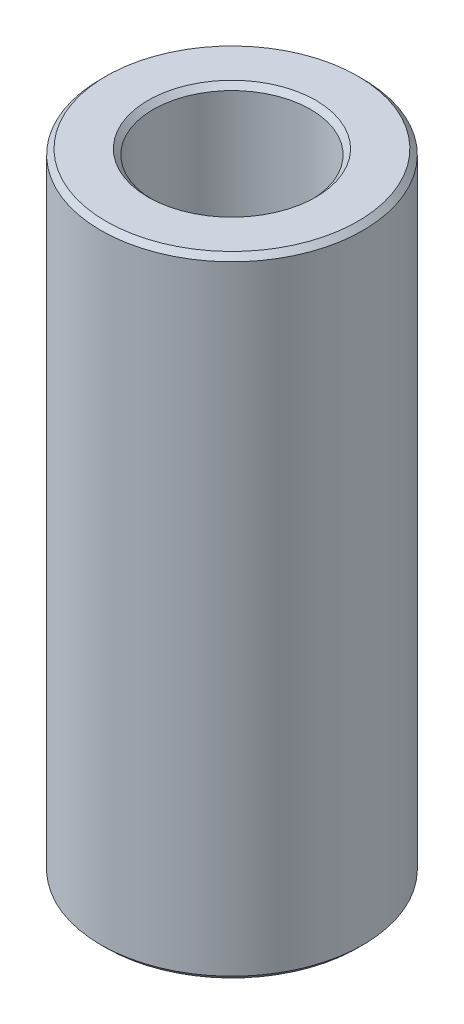
ISO-10303-21;
HEADER;
FILE_DESCRIPTION(('STEP AP214'),'2;1');
FILE_NAME('part.step','',(''),(''),'','','');
FILE_SCHEMA(('AUTOMOTIVE_DESIGN { 1 0 10303 214 1 1 1 1 }'));
ENDSEC;
DATA;
#1=APPLICATION_CONTEXT('core data for automotive mechanical design processes');
#2=APPLICATION_PROTOCOL_DEFINITION('international standard','automotive_design',2000,#1);
#3=PRODUCT_CONTEXT('',#1,'mechanical');
#4=PRODUCT('Part','Part','',(#3));
#5=PRODUCT_RELATED_PRODUCT_CATEGORY('part','',(#4));
#6=PRODUCT_DEFINITION_FORMATION('','',#4);
#7=PRODUCT_DEFINITION_CONTEXT('part definition',#1,'design');
#8=PRODUCT_DEFINITION('design','',#6,#7);
#9=PRODUCT_DEFINITION_SHAPE('','',#8);
#10=(LENGTH_UNIT() NAMED_UNIT(*) SI_UNIT(.MILLI.,.METRE.));
#11=(NAMED_UNIT(*) PLANE_ANGLE_UNIT() SI_UNIT($,.RADIAN.));
#12=(NAMED_UNIT(*) SI_UNIT($,.STERADIAN.) SOLID_ANGLE_UNIT());
#13=UNCERTAINTY_MEASURE_WITH_UNIT(LENGTH_MEASURE(1.E-05),#10,'distance_accuracy_value','');
#14=(GEOMETRIC_REPRESENTATION_CONTEXT(3) GLOBAL_UNCERTAINTY_ASSIGNED_CONTEXT((#13)) GLOBAL_UNIT_ASSIGNED_CONTEXT((#10,
#11,#12)) REPRESENTATION_CONTEXT('',''));
#15=CARTESIAN_POINT('',(0.,0.,0.));
#16=DIRECTION('',(0.,0.,1.));
#17=DIRECTION('',(1.,0.,0.));
#18=AXIS2_PLACEMENT_3D('',#15,#16,#17);
#19=CARTESIAN_POINT('',(0.,12.,0.));
#20=DIRECTION('',(0.,1.,0.));
#21=DIRECTION('',(0.,0.,1.));
#22=AXIS2_PLACEMENT_3D('',#19,#20,#21);
#23=PLANE('',#22);
#24=CARTESIAN_POINT('',(0.,12.,0.));
#25=DIRECTION('',(0.,1.,0.));
#26=DIRECTION('',(0.,0.,1.));
#27=AXIS2_PLACEMENT_3D('',#24,#25,#26);
#28=CIRCLE('',#27,1.6);
#29=CARTESIAN_POINT('',(0.,12.,1.6));
#30=VERTEX_POINT('',#29);
#31=EDGE_CURVE('E54',#30,#30,#28,.F.);
#32=ORIENTED_EDGE('',*,*,#31,.T.);
#33=EDGE_LOOP('',(#32));
#34=FACE_BOUND('',#33,.T.);
#35=CARTESIAN_POINT('',(0.,12.,0.));
#36=DIRECTION('',(0.,1.,0.));
#37=DIRECTION('',(0.,0.,1.));
#38=AXIS2_PLACEMENT_3D('',#35,#36,#37);
#39=CIRCLE('',#38,2.4);
#40=CARTESIAN_POINT('',(0.,12.,2.4));
#41=VERTEX_POINT('',#40);
#42=EDGE_CURVE('E57',#41,#41,#39,.T.);
#43=ORIENTED_EDGE('',*,*,#42,.T.);
#44=EDGE_LOOP('',(#43));
#45=FACE_BOUND('',#44,.T.);
#46=ADVANCED_FACE('F33',(#34,#45),#23,.T.);
#47=CARTESIAN_POINT('',(0.,0.,0.));
#48=DIRECTION('',(0.,1.,0.));
#49=DIRECTION('',(0.,0.,1.));
#50=AXIS2_PLACEMENT_3D('',#47,#48,#49);
#51=PLANE('',#50);
#52=CARTESIAN_POINT('',(0.,0.,0.));
#53=DIRECTION('',(0.,1.,0.));
#54=DIRECTION('',(0.,0.,1.));
#55=AXIS2_PLACEMENT_3D('',#52,#53,#54);
#56=CIRCLE('',#55,1.6);
#57=CARTESIAN_POINT('',(0.,0.,1.6));
#58=VERTEX_POINT('',#57);
#59=EDGE_CURVE('E10',#58,#58,#56,.T.);
#60=ORIENTED_EDGE('',*,*,#59,.T.);
#61=EDGE_LOOP('',(#60));
#62=FACE_BOUND('',#61,.T.);
#63=CARTESIAN_POINT('',(0.,0.,0.));
#64=DIRECTION('',(0.,1.,0.));
#65=DIRECTION('',(0.,0.,1.));
#66=AXIS2_PLACEMENT_3D('',#63,#64,#65);
#67=CIRCLE('',#66,2.4);
#68=CARTESIAN_POINT('',(0.,0.,2.4));
#69=VERTEX_POINT('',#68);
#70=EDGE_CURVE('E41',#69,#69,#67,.F.);
#71=ORIENTED_EDGE('',*,*,#70,.T.);
#72=EDGE_LOOP('',(#71));
#73=FACE_BOUND('',#72,.T.);
#74=ADVANCED_FACE('F83',(#62,#73),#51,.F.);
#75=CARTESIAN_POINT('',(0.,12.,0.));
#76=DIRECTION('',(0.,-1.,0.));
#77=DIRECTION('',(0.,0.,-1.));
#78=AXIS2_PLACEMENT_3D('',#75,#76,#77);
#79=CYLINDRICAL_SURFACE('',#78,2.5);
#80=CARTESIAN_POINT('',(0.,11.9,0.));
#81=DIRECTION('',(0.,1.,0.));
#82=DIRECTION('',(0.,0.,1.));
#83=AXIS2_PLACEMENT_3D('',#80,#81,#82);
#84=CIRCLE('',#83,2.5);
#85=CARTESIAN_POINT('',(0.,11.9,2.5));
#86=VERTEX_POINT('',#85);
#87=EDGE_CURVE('E45',#86,#86,#84,.F.);
#88=ORIENTED_EDGE('',*,*,#87,.T.);
#89=EDGE_LOOP('',(#88));
#90=FACE_BOUND('',#89,.T.);
#91=CARTESIAN_POINT('',(0.,0.100000000000003,0.));
#92=DIRECTION('',(0.,1.,0.));
#93=DIRECTION('',(0.,0.,1.));
#94=AXIS2_PLACEMENT_3D('',#91,#92,#93);
#95=CIRCLE('',#94,2.5);
#96=CARTESIAN_POINT('',(0.,0.100000000000003,2.5));
#97=VERTEX_POINT('',#96);
#98=EDGE_CURVE('E49',#97,#97,#95,.T.);
#99=ORIENTED_EDGE('',*,*,#98,.T.);
#100=EDGE_LOOP('',(#99));
#101=FACE_BOUND('',#100,.T.);
#102=ADVANCED_FACE('F89',(#90,#101),#79,.T.);
#103=CARTESIAN_POINT('',(0.,12.,0.));
#104=DIRECTION('',(0.,-1.,0.));
#105=DIRECTION('',(0.,0.,-1.));
#106=AXIS2_PLACEMENT_3D('',#103,#104,#105);
#107=CYLINDRICAL_SURFACE('',#106,1.5);
#108=CARTESIAN_POINT('',(0.,11.9,0.));
#109=DIRECTION('',(0.,1.,0.));
#110=DIRECTION('',(0.,0.,1.));
#111=AXIS2_PLACEMENT_3D('',#108,#109,#110);
#112=CIRCLE('',#111,1.5);
#113=CARTESIAN_POINT('',(0.,11.9,1.5));
#114=VERTEX_POINT('',#113);
#115=EDGE_CURVE('E60',#114,#114,#112,.T.);
#116=ORIENTED_EDGE('',*,*,#115,.T.);
#117=EDGE_LOOP('',(#116));
#118=FACE_BOUND('',#117,.T.);
#119=CARTESIAN_POINT('',(0.,0.0999999999999994,0.));
#120=DIRECTION('',(0.,1.,0.));
#121=DIRECTION('',(0.,0.,1.));
#122=AXIS2_PLACEMENT_3D('',#119,#120,#121);
#123=CIRCLE('',#122,1.5);
#124=CARTESIAN_POINT('',(0.,0.0999999999999994,1.5));
#125=VERTEX_POINT('',#124);
#126=EDGE_CURVE('E63',#125,#125,#123,.F.);
#127=ORIENTED_EDGE('',*,*,#126,.T.);
#128=EDGE_LOOP('',(#127));
#129=FACE_BOUND('',#128,.T.);
#130=ADVANCED_FACE('F67',(#118,#129),#107,.F.);
#131=CARTESIAN_POINT('',(0.,11.9,0.));
#132=DIRECTION('',(0.,1.,0.));
#133=DIRECTION('',(0.,0.,1.));
#134=AXIS2_PLACEMENT_3D('',#131,#132,#133);
#135=CONICAL_SURFACE('',#134,1.5,0.785398163397445);
#136=ORIENTED_EDGE('',*,*,#31,.F.);
#137=EDGE_LOOP('',(#136));
#138=FACE_BOUND('',#137,.T.);
#139=ORIENTED_EDGE('',*,*,#115,.F.);
#140=EDGE_LOOP('',(#139));
#141=FACE_BOUND('',#140,.T.);
#142=ADVANCED_FACE('F78',(#138,#141),#135,.F.);
#143=CARTESIAN_POINT('',(0.,12.,0.));
#144=DIRECTION('',(0.,-1.,0.));
#145=DIRECTION('',(0.,0.,-1.));
#146=AXIS2_PLACEMENT_3D('',#143,#144,#145);
#147=CONICAL_SURFACE('',#146,2.4,0.785398163397444);
#148=ORIENTED_EDGE('',*,*,#87,.F.);
#149=EDGE_LOOP('',(#148));
#150=FACE_BOUND('',#149,.T.);
#151=ORIENTED_EDGE('',*,*,#42,.F.);
#152=EDGE_LOOP('',(#151));
#153=FACE_BOUND('',#152,.T.);
#154=ADVANCED_FACE('F72',(#150,#153),#147,.T.);
#155=CARTESIAN_POINT('',(0.,0.,0.));
#156=DIRECTION('',(0.,-1.,0.));
#157=DIRECTION('',(0.,0.,-1.));
#158=AXIS2_PLACEMENT_3D('',#155,#156,#157);
#159=CONICAL_SURFACE('',#158,1.6,0.785398163397444);
#160=ORIENTED_EDGE('',*,*,#126,.F.);
#161=EDGE_LOOP('',(#160));
#162=FACE_BOUND('',#161,.T.);
#163=ORIENTED_EDGE('',*,*,#59,.F.);
#164=EDGE_LOOP('',(#163));
#165=FACE_BOUND('',#164,.T.);
#166=ADVANCED_FACE('F69',(#162,#165),#159,.F.);
#167=CARTESIAN_POINT('',(0.,0.100000000000003,0.));
#168=DIRECTION('',(0.,1.,0.));
#169=DIRECTION('',(0.,0.,1.));
#170=AXIS2_PLACEMENT_3D('',#167,#168,#169);
#171=CONICAL_SURFACE('',#170,2.5,0.785398163397448);
#172=ORIENTED_EDGE('',*,*,#70,.F.);
#173=EDGE_LOOP('',(#172));
#174=FACE_BOUND('',#173,.T.);
#175=ORIENTED_EDGE('',*,*,#98,.F.);
#176=EDGE_LOOP('',(#175));
#177=FACE_BOUND('',#176,.T.);
#178=ADVANCED_FACE('F36',(#174,#177),#171,.T.);
#179=CLOSED_SHELL('',(#46,#74,#102,#130,#142,#154,#166,#178));
#180=MANIFOLD_SOLID_BREP('B2',#179);
#181=ADVANCED_BREP_SHAPE_REPRESENTATION('',(#18,#180),#14);
#182=SHAPE_DEFINITION_REPRESENTATION(#9,#181);
ENDSEC;
END-ISO-10303-21;
